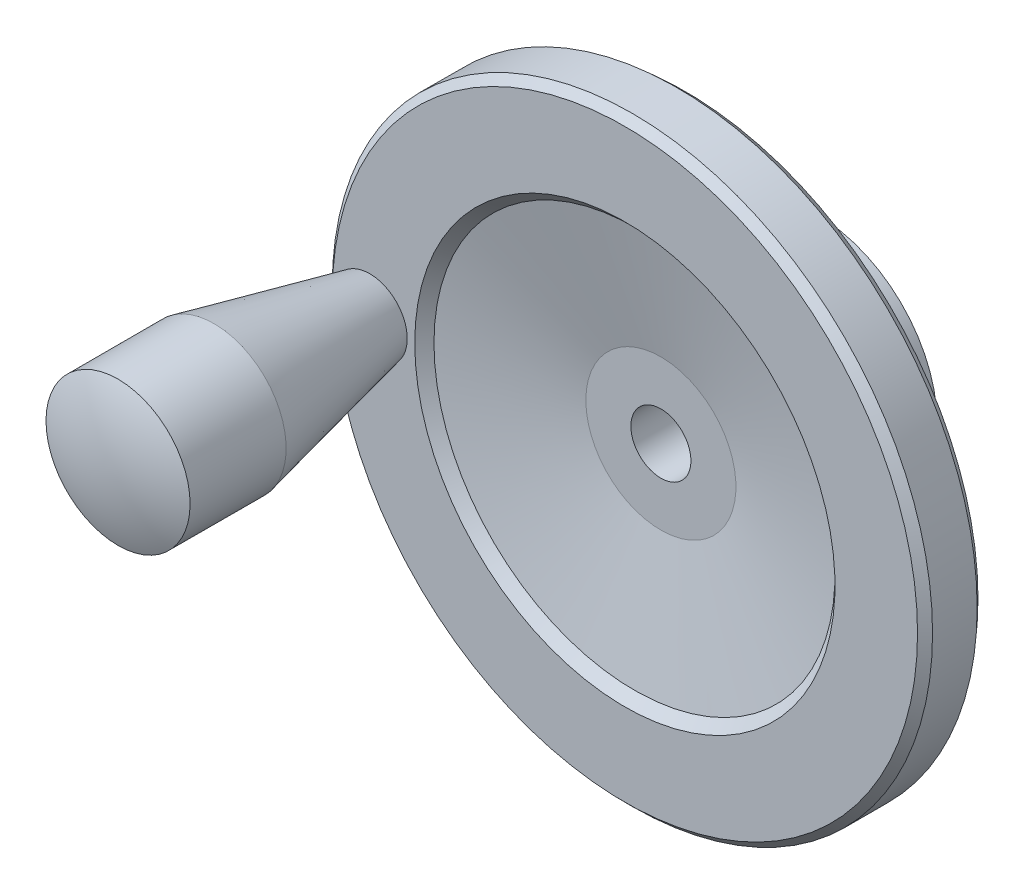
ISO-10303-21;
HEADER;
FILE_DESCRIPTION(('STEP AP214'),'2;1');
FILE_NAME('part.step','',(''),(''),'','','');
FILE_SCHEMA(('AUTOMOTIVE_DESIGN { 1 0 10303 214 1 1 1 1 }'));
ENDSEC;
DATA;
#1=APPLICATION_CONTEXT('core data for automotive mechanical design processes');
#2=APPLICATION_PROTOCOL_DEFINITION('international standard','automotive_design',2000,#1);
#3=PRODUCT_CONTEXT('',#1,'mechanical');
#4=PRODUCT('Part','Part','',(#3));
#5=PRODUCT_RELATED_PRODUCT_CATEGORY('part','',(#4));
#6=PRODUCT_DEFINITION_FORMATION('','',#4);
#7=PRODUCT_DEFINITION_CONTEXT('part definition',#1,'design');
#8=PRODUCT_DEFINITION('design','',#6,#7);
#9=PRODUCT_DEFINITION_SHAPE('','',#8);
#10=(LENGTH_UNIT() NAMED_UNIT(*) SI_UNIT(.MILLI.,.METRE.));
#11=(NAMED_UNIT(*) PLANE_ANGLE_UNIT() SI_UNIT($,.RADIAN.));
#12=(NAMED_UNIT(*) SI_UNIT($,.STERADIAN.) SOLID_ANGLE_UNIT());
#13=UNCERTAINTY_MEASURE_WITH_UNIT(LENGTH_MEASURE(1.E-05),#10,'distance_accuracy_value','');
#14=(GEOMETRIC_REPRESENTATION_CONTEXT(3) GLOBAL_UNCERTAINTY_ASSIGNED_CONTEXT((#13)) GLOBAL_UNIT_ASSIGNED_CONTEXT((#10,
#11,#12)) REPRESENTATION_CONTEXT('',''));
#15=CARTESIAN_POINT('',(0.,0.,0.));
#16=DIRECTION('',(0.,0.,1.));
#17=DIRECTION('',(1.,0.,0.));
#18=AXIS2_PLACEMENT_3D('',#15,#16,#17);
#19=CARTESIAN_POINT('',(0.,0.,6.35));
#20=DIRECTION('',(0.,0.,1.));
#21=DIRECTION('',(1.,0.,0.));
#22=AXIS2_PLACEMENT_3D('',#19,#20,#21);
#23=PLANE('',#22);
#24=CARTESIAN_POINT('',(0.,0.,6.34999999999999));
#25=DIRECTION('',(0.,0.,-1.));
#26=DIRECTION('',(-1.,0.,0.));
#27=AXIS2_PLACEMENT_3D('',#24,#25,#26);
#28=CIRCLE('',#27,22.225);
#29=CARTESIAN_POINT('',(-22.225,0.,6.34999999999999));
#30=VERTEX_POINT('',#29);
#31=EDGE_CURVE('E159',#30,#30,#28,.T.);
#32=ORIENTED_EDGE('',*,*,#31,.T.);
#33=EDGE_LOOP('',(#32));
#34=FACE_BOUND('',#33,.T.);
#35=CARTESIAN_POINT('',(0.,0.,6.35));
#36=DIRECTION('',(0.,0.,1.));
#37=DIRECTION('',(1.,0.,0.));
#38=AXIS2_PLACEMENT_3D('',#35,#36,#37);
#39=CIRCLE('',#38,30.95625);
#40=CARTESIAN_POINT('',(-30.95625,0.,6.35));
#41=VERTEX_POINT('',#40);
#42=EDGE_CURVE('E12',#41,#41,#39,.T.);
#43=ORIENTED_EDGE('',*,*,#42,.T.);
#44=CARTESIAN_POINT('',(-26.9875,0.,6.35));
#45=DIRECTION('',(0.,0.,-1.));
#46=DIRECTION('',(-1.,0.,0.));
#47=AXIS2_PLACEMENT_3D('',#44,#45,#46);
#48=CIRCLE('',#47,3.96875);
#49=EDGE_CURVE('E55',#41,#41,#48,.T.);
#50=ORIENTED_EDGE('',*,*,#49,.T.);
#51=EDGE_LOOP('',(#43,#50));
#52=FACE_BOUND('',#51,.T.);
#53=ADVANCED_FACE('F42',(#34,#52),#23,.T.);
#54=CARTESIAN_POINT('',(0.,0.,-13.97));
#55=DIRECTION('',(0.,0.,1.));
#56=DIRECTION('',(1.,0.,0.));
#57=AXIS2_PLACEMENT_3D('',#54,#55,#56);
#58=PLANE('',#57);
#59=CARTESIAN_POINT('',(0.,0.,-13.97));
#60=DIRECTION('',(0.,0.,1.));
#61=DIRECTION('',(1.,0.,0.));
#62=AXIS2_PLACEMENT_3D('',#59,#60,#61);
#63=CIRCLE('',#62,12.7);
#64=CARTESIAN_POINT('',(12.7,0.,-13.97));
#65=VERTEX_POINT('',#64);
#66=EDGE_CURVE('E174',#65,#65,#63,.T.);
#67=ORIENTED_EDGE('',*,*,#66,.F.);
#68=EDGE_LOOP('',(#67));
#69=FACE_BOUND('',#68,.T.);
#70=CARTESIAN_POINT('',(0.,0.,-13.97));
#71=DIRECTION('',(0.,0.,1.));
#72=DIRECTION('',(1.,0.,0.));
#73=AXIS2_PLACEMENT_3D('',#70,#71,#72);
#74=CIRCLE('',#73,8.255);
#75=CARTESIAN_POINT('',(8.255,0.,-13.97));
#76=VERTEX_POINT('',#75);
#77=EDGE_CURVE('E155',#76,#76,#74,.F.);
#78=ORIENTED_EDGE('',*,*,#77,.F.);
#79=EDGE_LOOP('',(#78));
#80=FACE_BOUND('',#79,.T.);
#81=ADVANCED_FACE('F106',(#69,#80),#58,.F.);
#82=CARTESIAN_POINT('',(0.,0.,6.35));
#83=DIRECTION('',(0.,0.,-1.));
#84=DIRECTION('',(-1.,0.,0.));
#85=AXIS2_PLACEMENT_3D('',#82,#83,#84);
#86=CYLINDRICAL_SURFACE('',#85,31.75);
#87=CARTESIAN_POINT('',(0.,0.,0.839659951334315));
#88=DIRECTION('',(0.,0.,1.));
#89=DIRECTION('',(1.,0.,0.));
#90=AXIS2_PLACEMENT_3D('',#87,#88,#89);
#91=CIRCLE('',#90,31.75);
#92=CARTESIAN_POINT('',(31.75,0.,0.839659951334315));
#93=VERTEX_POINT('',#92);
#94=EDGE_CURVE('E139',#93,#93,#91,.T.);
#95=ORIENTED_EDGE('',*,*,#94,.T.);
#96=EDGE_LOOP('',(#95));
#97=FACE_BOUND('',#96,.T.);
#98=CARTESIAN_POINT('',(0.,0.,5.55625));
#99=DIRECTION('',(0.,0.,1.));
#100=DIRECTION('',(1.,0.,0.));
#101=AXIS2_PLACEMENT_3D('',#98,#99,#100);
#102=CIRCLE('',#101,31.75);
#103=CARTESIAN_POINT('',(31.75,0.,5.55625));
#104=VERTEX_POINT('',#103);
#105=EDGE_CURVE('E140',#104,#104,#102,.F.);
#106=ORIENTED_EDGE('',*,*,#105,.T.);
#107=EDGE_LOOP('',(#106));
#108=FACE_BOUND('',#107,.T.);
#109=ADVANCED_FACE('F112',(#97,#108),#86,.T.);
#110=CARTESIAN_POINT('',(0.,0.,6.34999999999999));
#111=DIRECTION('',(0.,0.,1.));
#112=DIRECTION('',(1.,0.,0.));
#113=AXIS2_PLACEMENT_3D('',#110,#111,#112);
#114=CONICAL_SURFACE('',#113,22.225,0.785398163397447);
#115=CARTESIAN_POINT('',(0.,0.,5.33399999999999));
#116=DIRECTION('',(0.,0.,-1.));
#117=DIRECTION('',(-1.,0.,0.));
#118=AXIS2_PLACEMENT_3D('',#115,#116,#117);
#119=CIRCLE('',#118,21.209);
#120=CARTESIAN_POINT('',(-21.209,0.,5.33399999999999));
#121=VERTEX_POINT('',#120);
#122=EDGE_CURVE('E162',#121,#121,#119,.T.);
#123=ORIENTED_EDGE('',*,*,#122,.T.);
#124=EDGE_LOOP('',(#123));
#125=FACE_BOUND('',#124,.T.);
#126=ORIENTED_EDGE('',*,*,#31,.F.);
#127=EDGE_LOOP('',(#126));
#128=FACE_BOUND('',#127,.T.);
#129=ADVANCED_FACE('F118',(#125,#128),#114,.F.);
#130=CARTESIAN_POINT('',(0.,0.,5.33399999999999));
#131=DIRECTION('',(0.,0.,1.));
#132=DIRECTION('',(1.,0.,0.));
#133=AXIS2_PLACEMENT_3D('',#130,#131,#132);
#134=CONICAL_SURFACE('',#133,21.209,1.36330010035969);
#135=CARTESIAN_POINT('',(0.,0.,2.53999999999999));
#136=DIRECTION('',(0.,0.,-1.));
#137=DIRECTION('',(-1.,0.,0.));
#138=AXIS2_PLACEMENT_3D('',#135,#136,#137);
#139=CIRCLE('',#138,7.9375);
#140=CARTESIAN_POINT('',(-7.9375,0.,2.53999999999999));
#141=VERTEX_POINT('',#140);
#142=EDGE_CURVE('E165',#141,#141,#139,.T.);
#143=ORIENTED_EDGE('',*,*,#142,.T.);
#144=EDGE_LOOP('',(#143));
#145=FACE_BOUND('',#144,.T.);
#146=ORIENTED_EDGE('',*,*,#122,.F.);
#147=EDGE_LOOP('',(#146));
#148=FACE_BOUND('',#147,.T.);
#149=ADVANCED_FACE('F214',(#145,#148),#134,.F.);
#150=CARTESIAN_POINT('',(7.9375,0.,2.53999999999999));
#151=DIRECTION('',(0.,0.,1.));
#152=DIRECTION('',(1.,0.,0.));
#153=AXIS2_PLACEMENT_3D('',#150,#151,#152);
#154=PLANE('',#153);
#155=CARTESIAN_POINT('',(0.,0.,2.53999999999999));
#156=DIRECTION('',(0.,0.,1.));
#157=DIRECTION('',(1.,0.,0.));
#158=AXIS2_PLACEMENT_3D('',#155,#156,#157);
#159=CIRCLE('',#158,3.175);
#160=CARTESIAN_POINT('',(3.175,0.,2.53999999999999));
#161=VERTEX_POINT('',#160);
#162=EDGE_CURVE('E185',#161,#161,#159,.T.);
#163=ORIENTED_EDGE('',*,*,#162,.F.);
#164=EDGE_LOOP('',(#163));
#165=FACE_BOUND('',#164,.T.);
#166=ORIENTED_EDGE('',*,*,#142,.F.);
#167=EDGE_LOOP('',(#166));
#168=FACE_BOUND('',#167,.T.);
#169=ADVANCED_FACE('F208',(#165,#168),#154,.T.);
#170=CARTESIAN_POINT('',(0.,0.,-1.27));
#171=DIRECTION('',(0.,0.,1.));
#172=DIRECTION('',(1.,0.,0.));
#173=AXIS2_PLACEMENT_3D('',#170,#171,#172);
#174=CONICAL_SURFACE('',#173,7.9375,1.5175134752352);
#175=CARTESIAN_POINT('',(0.,0.,-0.0422732540646938));
#176=DIRECTION('',(0.,0.,-1.));
#177=DIRECTION('',(-1.,0.,0.));
#178=AXIS2_PLACEMENT_3D('',#175,#176,#177);
#179=CIRCLE('',#178,30.957376486287);
#180=CARTESIAN_POINT('',(30.957376486287,0.,-0.0422732540646936));
#181=VERTEX_POINT('',#180);
#182=EDGE_CURVE('E50',#181,#181,#179,.T.);
#183=CARTESIAN_POINT('',(0.,0.,-1.27));
#184=DIRECTION('',(0.,0.,-1.));
#185=DIRECTION('',(-1.,0.,0.));
#186=AXIS2_PLACEMENT_3D('',#183,#184,#185);
#187=CIRCLE('',#186,7.9375);
#188=CARTESIAN_POINT('',(7.93750000000001,0.,-1.27));
#189=VERTEX_POINT('',#188);
#190=EDGE_CURVE('E170',#189,#189,#187,.T.);
#191=CARTESIAN_POINT('',(30.957376486287,0.,-0.0422732540646936));
#192=CARTESIAN_POINT('',(30.7175861062215,0.,-0.0550620743348531));
#193=CARTESIAN_POINT('',(30.477795726156,0.,-0.0678508946050125));
#194=CARTESIAN_POINT('',(29.998214966025,0.,-0.0934285351453313));
#195=CARTESIAN_POINT('',(29.7584245859595,0.,-0.106217355415491));
#196=CARTESIAN_POINT('',(29.2788438258285,0.,-0.13179499595581));
#197=CARTESIAN_POINT('',(29.0390534457631,0.,-0.144583816225969));
#198=CARTESIAN_POINT('',(28.5594726856321,0.,-0.170161456766288));
#199=CARTESIAN_POINT('',(28.3196823055666,0.,-0.182950277036447));
#200=CARTESIAN_POINT('',(27.8401015454356,0.,-0.208527917576766));
#201=CARTESIAN_POINT('',(27.6003111653701,0.,-0.221316737846926));
#202=CARTESIAN_POINT('',(27.1207304052391,0.,-0.246894378387245));
#203=CARTESIAN_POINT('',(26.8809400251737,0.,-0.259683198657404));
#204=CARTESIAN_POINT('',(26.4013592650427,0.,-0.285260839197723));
#205=CARTESIAN_POINT('',(26.1615688849772,0.,-0.298049659467882));
#206=CARTESIAN_POINT('',(25.6819881248462,0.,-0.323627300008201));
#207=CARTESIAN_POINT('',(25.4421977447807,0.,-0.336416120278361));
#208=CARTESIAN_POINT('',(24.9626169846497,0.,-0.36199376081868));
#209=CARTESIAN_POINT('',(24.7228266045843,0.,-0.374782581088839));
#210=CARTESIAN_POINT('',(24.2432458444533,0.,-0.400360221629158));
#211=CARTESIAN_POINT('',(24.0034554643878,0.,-0.413149041899317));
#212=CARTESIAN_POINT('',(23.5238747042568,0.,-0.438726682439636));
#213=CARTESIAN_POINT('',(23.2840843241913,0.,-0.451515502709796));
#214=CARTESIAN_POINT('',(22.8045035640603,0.,-0.477093143250115));
#215=CARTESIAN_POINT('',(22.5647131839949,0.,-0.489881963520274));
#216=CARTESIAN_POINT('',(22.0851324238639,0.,-0.515459604060593));
#217=CARTESIAN_POINT('',(21.8453420437984,0.,-0.528248424330752));
#218=CARTESIAN_POINT('',(21.3657612836674,0.,-0.553826064871071));
#219=CARTESIAN_POINT('',(21.1259709036019,0.,-0.56661488514123));
#220=CARTESIAN_POINT('',(20.6463901434709,0.,-0.592192525681549));
#221=CARTESIAN_POINT('',(20.4065997634054,0.,-0.604981345951709));
#222=CARTESIAN_POINT('',(19.9270190032745,0.,-0.630558986492028));
#223=CARTESIAN_POINT('',(19.687228623209,0.,-0.643347806762187));
#224=CARTESIAN_POINT('',(19.207647863078,0.,-0.668925447302506));
#225=CARTESIAN_POINT('',(18.9678574830125,0.,-0.681714267572665));
#226=CARTESIAN_POINT('',(18.4882767228815,0.,-0.707291908112984));
#227=CARTESIAN_POINT('',(18.248486342816,0.,-0.720080728383144));
#228=CARTESIAN_POINT('',(17.7689055826851,0.,-0.745658368923463));
#229=CARTESIAN_POINT('',(17.5291152026196,0.,-0.758447189193622));
#230=CARTESIAN_POINT('',(17.0495344424886,0.,-0.784024829733941));
#231=CARTESIAN_POINT('',(16.8097440624231,0.,-0.7968136500041));
#232=CARTESIAN_POINT('',(16.3301633022921,0.,-0.822391290544419));
#233=CARTESIAN_POINT('',(16.0903729222266,0.,-0.835180110814579));
#234=CARTESIAN_POINT('',(15.6107921620957,0.,-0.860757751354898));
#235=CARTESIAN_POINT('',(15.3710017820302,0.,-0.873546571625057));
#236=CARTESIAN_POINT('',(14.8914210218992,0.,-0.899124212165376));
#237=CARTESIAN_POINT('',(14.6516306418337,0.,-0.911913032435535));
#238=CARTESIAN_POINT('',(14.1720498817027,0.,-0.937490672975854));
#239=CARTESIAN_POINT('',(13.9322595016372,0.,-0.950279493246014));
#240=CARTESIAN_POINT('',(13.4526787415063,0.,-0.975857133786333));
#241=CARTESIAN_POINT('',(13.2128883614408,0.,-0.988645954056492));
#242=CARTESIAN_POINT('',(12.7333076013098,0.,-1.01422359459681));
#243=CARTESIAN_POINT('',(12.4935172212443,0.,-1.02701241486697));
#244=CARTESIAN_POINT('',(12.0139364611133,0.,-1.05259005540729));
#245=CARTESIAN_POINT('',(11.7741460810478,0.,-1.06537887567745));
#246=CARTESIAN_POINT('',(11.2945653209169,0.,-1.09095651621777));
#247=CARTESIAN_POINT('',(11.0547749408514,0.,-1.10374533648793));
#248=CARTESIAN_POINT('',(10.5751941807204,0.,-1.12932297702825));
#249=CARTESIAN_POINT('',(10.3354038006549,0.,-1.14211179729841));
#250=CARTESIAN_POINT('',(9.85582304052392,0.,-1.16768943783872));
#251=CARTESIAN_POINT('',(9.61603266045844,0.,-1.18047825810888));
#252=CARTESIAN_POINT('',(9.13645190032746,0.,-1.2060558986492));
#253=CARTESIAN_POINT('',(8.89666152026197,0.,-1.21884471891936));
#254=CARTESIAN_POINT('',(8.41708076013099,0.,-1.24442235945968));
#255=CARTESIAN_POINT('',(8.1772903800655,0.,-1.25721117972984));
#256=CARTESIAN_POINT('',(7.93750000000001,0.,-1.27));
#257=B_SPLINE_CURVE_WITH_KNOTS('',3,(#191,#192,#193,#194,#195,#196,#197,#198,#199,#200,#201,
#202,#203,#204,#205,#206,#207,#208,#209,#210,#211,#212,#213,#214,#215,#216,#217,#218,#219,#220,
#221,#222,#223,#224,#225,#226,#227,#228,#229,#230,#231,#232,#233,#234,#235,#236,#237,#238,#239,
#240,#241,#242,#243,#244,#245,#246,#247,#248,#249,#250,#251,#252,#253,#254,#255,#256),
.UNSPECIFIED.,.F.,.F.,(4,2,2,2,2,2,2,2,2,2,2,2,2,2,2,2,2,2,2,2,2,2,2,2,2,2,2,2,2,2,2,2,4),(0.,
0.720393519309193,1.44078703861839,2.16118055792759,2.88157407723678,3.60196759654598,
4.32236111585517,5.04275463516437,5.76314815447356,6.48354167378276,7.20393519309195,
7.92432871240115,8.64472223171034,9.36511575101953,10.0855092703287,10.8059027896379,
11.5262963089471,12.2466898282563,12.9670833475655,13.6874768668747,14.4078703861839,
15.1282639054931,15.8486574248023,16.5690509441115,17.2894444634207,18.0098379827299,
18.7302315020391,19.4506250213483,20.1710185406575,20.8914120599667,21.6118055792759,
22.3321990985851,23.0525926178942),.UNSPECIFIED.);
#258=EDGE_CURVE('BSEAM202',#181,#189,#257,.T.);
#259=ORIENTED_EDGE('',*,*,#182,.T.);
#260=ORIENTED_EDGE('',*,*,#190,.F.);
#261=ORIENTED_EDGE('',*,*,#258,.T.);
#262=ORIENTED_EDGE('',*,*,#258,.F.);
#263=EDGE_LOOP('',(#259,#261,#260,#262));
#264=FACE_BOUND('',#263,.T.);
#265=ADVANCED_FACE('F202',(#264),#174,.T.);
#266=CARTESIAN_POINT('',(0.,0.,-7.62));
#267=DIRECTION('',(0.,0.,1.));
#268=DIRECTION('',(1.,0.,0.));
#269=AXIS2_PLACEMENT_3D('',#266,#267,#268);
#270=CYLINDRICAL_SURFACE('',#269,7.9375);
#271=CARTESIAN_POINT('',(-7.9375,0.,-1.79070000000001));
#272=CARTESIAN_POINT('',(-7.93749816002049,-0.111503398078413,-1.79070301087657));
#273=CARTESIAN_POINT('',(-7.93512712027587,-0.223040059295097,-1.79996667520844));
#274=CARTESIAN_POINT('',(-7.92589845272975,-0.442912489839705,-1.83671847716166));
#275=CARTESIAN_POINT('',(-7.9190383814496,-0.551246482298939,-1.86421654027656));
#276=CARTESIAN_POINT('',(-7.9015906585303,-0.761507028243949,-1.93649449462618));
#277=CARTESIAN_POINT('',(-7.89100757037762,-0.863441246794077,-1.98125323502619));
#278=CARTESIAN_POINT('',(-7.86723867370605,-1.05835486949294,-2.08670655576371));
#279=CARTESIAN_POINT('',(-7.85405275492695,-1.15133389403648,-2.14740181123434));
#280=CARTESIAN_POINT('',(-7.82619410708127,-1.32767529850183,-2.28436861412058));
#281=CARTESIAN_POINT('',(-7.8114977905554,-1.41082008434518,-2.3609155229406));
#282=CARTESIAN_POINT('',(-7.78243004832225,-1.56324103842942,-2.52682343563716));
#283=CARTESIAN_POINT('',(-7.7680586607557,-1.63251558597806,-2.61618593488249));
#284=CARTESIAN_POINT('',(-7.74102926906689,-1.75626265170812,-2.80689009280748));
#285=CARTESIAN_POINT('',(-7.72840116269003,-1.81048997798445,-2.90839547915738));
#286=CARTESIAN_POINT('',(-7.70663285880925,-1.90102585405554,-3.11945497058204));
#287=CARTESIAN_POINT('',(-7.69749208189701,-1.93733738079571,-3.22900773500122));
#288=CARTESIAN_POINT('',(-7.6839761021266,-1.99026513489226,-3.45065501807786));
#289=CARTESIAN_POINT('',(-7.67950617818345,-2.00727345615104,-3.56264999559032));
#290=CARTESIAN_POINT('',(-7.67555461600948,-2.02233359726657,-3.78798601918889));
#291=CARTESIAN_POINT('',(-7.67607213547378,-2.02038861805277,-3.90132683475382));
#292=CARTESIAN_POINT('',(-7.68195193484191,-1.99790980194531,-4.12311798112947));
#293=CARTESIAN_POINT('',(-7.68719195548542,-1.97784503574137,-4.2316196026368));
#294=CARTESIAN_POINT('',(-7.70173126273645,-1.92044525717152,-4.44366365440085));
#295=CARTESIAN_POINT('',(-7.71103084765711,-1.88310897561297,-4.54720571958873));
#296=CARTESIAN_POINT('',(-7.73275244872648,-1.79183081789414,-4.74764018840945));
#297=CARTESIAN_POINT('',(-7.74520594630838,-1.73772020622837,-4.84445219439667));
#298=CARTESIAN_POINT('',(-7.77181462555737,-1.61454732074231,-5.02778944212458));
#299=CARTESIAN_POINT('',(-7.78597011448625,-1.54548234539153,-5.11431282082684));
#300=CARTESIAN_POINT('',(-7.81490107198831,-1.39193958661512,-5.27730274624502));
#301=CARTESIAN_POINT('',(-7.82968249645327,-1.30706645875347,-5.35339628841263));
#302=CARTESIAN_POINT('',(-7.8578229461783,-1.12558600074782,-5.49034253030235));
#303=CARTESIAN_POINT('',(-7.87118192489005,-1.0289782868209,-5.55119473135273));
#304=CARTESIAN_POINT('',(-7.89504267368315,-0.826227078247713,-5.65607486567204));
#305=CARTESIAN_POINT('',(-7.9055338112987,-0.72004998832284,-5.70004042958235));
#306=CARTESIAN_POINT('',(-7.92239962662862,-0.50148514980063,-5.76939353773939));
#307=CARTESIAN_POINT('',(-7.92877512054522,-0.38909863743981,-5.79478476572628));
#308=CARTESIAN_POINT('',(-7.93656983337389,-0.164492808121927,-5.82569465708688));
#309=CARTESIAN_POINT('',(-7.93811565401553,-0.0523476554168241,-5.83172105993389));
#310=CARTESIAN_POINT('',(-7.93643831154206,0.171349315723136,-5.82512530390916));
#311=CARTESIAN_POINT('',(-7.93321559401008,0.28290118861794,-5.81250488743918));
#312=CARTESIAN_POINT('',(-7.92244458469611,0.500468334229656,-5.76939175399593));
#313=CARTESIAN_POINT('',(-7.9149637609624,0.606542457585203,-5.73917763454095));
#314=CARTESIAN_POINT('',(-7.89652100083225,0.812109942194255,-5.6620543511128));
#315=CARTESIAN_POINT('',(-7.88555870582623,0.911602624249008,-5.61514346722625));
#316=CARTESIAN_POINT('',(-7.86106744858432,1.10319094964695,-5.50498522049568));
#317=CARTESIAN_POINT('',(-7.84749533139252,1.19511864088525,-5.44145558140435));
#318=CARTESIAN_POINT('',(-7.81935530263441,1.36718817481565,-5.30022245191821));
#319=CARTESIAN_POINT('',(-7.80478721307994,1.44732790279812,-5.22251642392844));
#320=CARTESIAN_POINT('',(-7.77583879234541,1.59565130804696,-5.05277553324284));
#321=CARTESIAN_POINT('',(-7.76147270708816,1.66347825059062,-4.96042597867727));
#322=CARTESIAN_POINT('',(-7.73496752417001,1.78267397543408,-4.76535767480774));
#323=CARTESIAN_POINT('',(-7.72282832864778,1.83404348103489,-4.66263938146877));
#324=CARTESIAN_POINT('',(-7.70228694397818,1.91848150117721,-4.4502928765654));
#325=CARTESIAN_POINT('',(-7.69386272288785,1.95165820338814,-4.34070992876195));
#326=CARTESIAN_POINT('',(-7.68168770839288,1.99904730167293,-4.11727334987908));
#327=CARTESIAN_POINT('',(-7.67793584933284,2.01326402212316,-4.00342069872258));
#328=CARTESIAN_POINT('',(-7.67561362323475,2.02209764720633,-3.77831227637714));
#329=CARTESIAN_POINT('',(-7.67689230766973,2.01728551668371,-3.66708011569547));
#330=CARTESIAN_POINT('',(-7.68413695162975,1.9895093545208,-3.4470692935877));
#331=CARTESIAN_POINT('',(-7.69010281039395,1.96654571308604,-3.33829057947123));
#332=CARTESIAN_POINT('',(-7.70596396634511,1.90343529435007,-3.12692051644875));
#333=CARTESIAN_POINT('',(-7.71583392345196,1.86339919983679,-3.02429408706908));
#334=CARTESIAN_POINT('',(-7.73839394276666,1.76736739517097,-2.82714042253614));
#335=CARTESIAN_POINT('',(-7.75108440967796,1.71136939438349,-2.73261435236997));
#336=CARTESIAN_POINT('',(-7.77828294081991,1.58322877348736,-2.55159422892804));
#337=CARTESIAN_POINT('',(-7.79283077842513,1.51069165506314,-2.46538536534951));
#338=CARTESIAN_POINT('',(-7.82187150616117,1.35229586813726,-2.30617779963382));
#339=CARTESIAN_POINT('',(-7.83636438234261,1.26643402294028,-2.23318225664588));
#340=CARTESIAN_POINT('',(-7.86398994917061,1.08186355587165,-2.1011225438378));
#341=CARTESIAN_POINT('',(-7.87709168255394,0.982942434749125,-2.04234838807517));
#342=CARTESIAN_POINT('',(-7.90012920674897,0.776297761221593,-1.94235741264225));
#343=CARTESIAN_POINT('',(-7.91006720448157,0.668580410982254,-1.90112834728707));
#344=CARTESIAN_POINT('',(-7.92423545810886,0.467589183826791,-1.84332763759659));
#345=CARTESIAN_POINT('',(-7.92917496350255,0.375250208911855,-1.82363573731096));
#346=CARTESIAN_POINT('',(-7.93580788140303,0.188615316992517,-1.79732117352952));
#347=CARTESIAN_POINT('',(-7.93750155641944,0.0943195588683766,-1.790697453131));
#348=CARTESIAN_POINT('',(-7.9375,0.,-1.79070000000001));
#349=B_SPLINE_CURVE_WITH_KNOTS('',3,(#271,#272,#273,#274,#275,#276,#277,#278,#279,#280,#281,
#282,#283,#284,#285,#286,#287,#288,#289,#290,#291,#292,#293,#294,#295,#296,#297,#298,#299,#300,
#301,#302,#303,#304,#305,#306,#307,#308,#309,#310,#311,#312,#313,#314,#315,#316,#317,#318,#319,
#320,#321,#322,#323,#324,#325,#326,#327,#328,#329,#330,#331,#332,#333,#334,#335,#336,#337,#338,
#339,#340,#341,#342,#343,#344,#345,#346,#347,#348),.UNSPECIFIED.,.T.,.F.,(4,2,2,2,2,2,2,2,2,2,2,
2,2,2,2,2,2,2,2,2,2,2,2,2,2,2,2,2,2,2,2,2,2,2,2,2,2,2,4),(0.,0.334164484371241,
0.668511013298198,1.00244913692187,1.33640140975415,1.67673208193919,2.01710249747929,
2.36273092362982,2.70830189971986,3.04672031013988,3.38508156773417,3.71492705213757,
4.04479677899854,4.37809872679735,4.71146093645367,5.05467999197064,5.39791027558673,
5.74239633260812,6.08681405117476,6.4221242648592,6.75740314836629,7.08751192486792,
7.4176547153184,7.75381718860838,8.09003989463379,8.43483092612514,8.77960680204131,
9.12230951849167,9.46493405822523,9.79735724148907,10.1297732788005,10.4600662257494,
10.790406595718,11.1296514585424,11.468977323992,11.8147293837015,12.1602397266312,
12.4429288345909,12.7255950788359),.UNSPECIFIED.);
#350=CARTESIAN_POINT('',(-7.9375,0.,-1.79070000000001));
#351=VERTEX_POINT('',#350);
#352=EDGE_CURVE('E67',#351,#351,#349,.T.);
#353=ORIENTED_EDGE('',*,*,#352,.T.);
#354=EDGE_LOOP('',(#353));
#355=FACE_BOUND('',#354,.T.);
#356=CARTESIAN_POINT('',(0.,0.,-7.62));
#357=DIRECTION('',(0.,0.,-1.));
#358=DIRECTION('',(-1.,0.,0.));
#359=AXIS2_PLACEMENT_3D('',#356,#357,#358);
#360=CIRCLE('',#359,7.9375);
#361=CARTESIAN_POINT('',(-7.9375,0.,-7.62));
#362=VERTEX_POINT('',#361);
#363=EDGE_CURVE('E169',#362,#362,#360,.T.);
#364=ORIENTED_EDGE('',*,*,#363,.F.);
#365=EDGE_LOOP('',(#364));
#366=FACE_BOUND('',#365,.T.);
#367=ORIENTED_EDGE('',*,*,#190,.T.);
#368=EDGE_LOOP('',(#367));
#369=FACE_BOUND('',#368,.T.);
#370=ADVANCED_FACE('F197',(#355,#366,#369),#270,.T.);
#371=CARTESIAN_POINT('',(0.,0.,-7.62));
#372=DIRECTION('',(0.,0.,-1.));
#373=DIRECTION('',(-1.,0.,0.));
#374=AXIS2_PLACEMENT_3D('',#371,#372,#373);
#375=PLANE('',#374);
#376=CARTESIAN_POINT('',(0.,0.,-7.62));
#377=DIRECTION('',(0.,0.,-1.));
#378=DIRECTION('',(-1.,0.,0.));
#379=AXIS2_PLACEMENT_3D('',#376,#377,#378);
#380=CIRCLE('',#379,11.90625);
#381=CARTESIAN_POINT('',(-11.90625,0.,-7.62));
#382=VERTEX_POINT('',#381);
#383=EDGE_CURVE('E145',#382,#382,#380,.F.);
#384=ORIENTED_EDGE('',*,*,#383,.T.);
#385=EDGE_LOOP('',(#384));
#386=FACE_BOUND('',#385,.T.);
#387=ORIENTED_EDGE('',*,*,#363,.T.);
#388=EDGE_LOOP('',(#387));
#389=FACE_BOUND('',#388,.T.);
#390=ADVANCED_FACE('F201',(#386,#389),#375,.F.);
#391=CARTESIAN_POINT('',(0.,0.,-70.2110244842766));
#392=DIRECTION('',(0.,0.,1.));
#393=DIRECTION('',(1.,0.,0.));
#394=AXIS2_PLACEMENT_3D('',#391,#392,#393);
#395=CYLINDRICAL_SURFACE('',#394,12.7);
#396=CARTESIAN_POINT('',(0.,0.,-8.41375));
#397=DIRECTION('',(0.,0.,-1.));
#398=DIRECTION('',(-1.,0.,0.));
#399=AXIS2_PLACEMENT_3D('',#396,#397,#398);
#400=CIRCLE('',#399,12.7);
#401=CARTESIAN_POINT('',(-12.7,0.,-8.41375));
#402=VERTEX_POINT('',#401);
#403=EDGE_CURVE('E151',#402,#402,#400,.T.);
#404=ORIENTED_EDGE('',*,*,#403,.T.);
#405=EDGE_LOOP('',(#404));
#406=FACE_BOUND('',#405,.T.);
#407=ORIENTED_EDGE('',*,*,#66,.T.);
#408=EDGE_LOOP('',(#407));
#409=FACE_BOUND('',#408,.T.);
#410=ADVANCED_FACE('F258',(#406,#409),#395,.T.);
#411=CARTESIAN_POINT('',(0.,0.,-14.224));
#412=DIRECTION('',(0.,0.,1.));
#413=DIRECTION('',(1.,0.,0.));
#414=AXIS2_PLACEMENT_3D('',#411,#412,#413);
#415=CYLINDRICAL_SURFACE('',#414,8.255);
#416=CARTESIAN_POINT('',(0.,0.,-14.224));
#417=DIRECTION('',(0.,0.,-1.));
#418=DIRECTION('',(-1.,0.,0.));
#419=AXIS2_PLACEMENT_3D('',#416,#417,#418);
#420=CIRCLE('',#419,8.255);
#421=CARTESIAN_POINT('',(-8.255,0.,-14.224));
#422=VERTEX_POINT('',#421);
#423=EDGE_CURVE('E181',#422,#422,#420,.T.);
#424=ORIENTED_EDGE('',*,*,#423,.F.);
#425=EDGE_LOOP('',(#424));
#426=FACE_BOUND('',#425,.T.);
#427=ORIENTED_EDGE('',*,*,#77,.T.);
#428=EDGE_LOOP('',(#427));
#429=FACE_BOUND('',#428,.T.);
#430=ADVANCED_FACE('F253',(#426,#429),#415,.T.);
#431=CARTESIAN_POINT('',(0.,0.,-14.224));
#432=DIRECTION('',(0.,0.,-1.));
#433=DIRECTION('',(-1.,0.,0.));
#434=AXIS2_PLACEMENT_3D('',#431,#432,#433);
#435=PLANE('',#434);
#436=CARTESIAN_POINT('',(0.,0.,-14.224));
#437=DIRECTION('',(0.,0.,-1.));
#438=DIRECTION('',(-1.,0.,0.));
#439=AXIS2_PLACEMENT_3D('',#436,#437,#438);
#440=CIRCLE('',#439,3.175);
#441=CARTESIAN_POINT('',(-3.175,0.,-14.224));
#442=VERTEX_POINT('',#441);
#443=EDGE_CURVE('E188',#442,#442,#440,.T.);
#444=ORIENTED_EDGE('',*,*,#443,.F.);
#445=EDGE_LOOP('',(#444));
#446=FACE_BOUND('',#445,.T.);
#447=ORIENTED_EDGE('',*,*,#423,.T.);
#448=EDGE_LOOP('',(#447));
#449=FACE_BOUND('',#448,.T.);
#450=ADVANCED_FACE('F257',(#446,#449),#435,.T.);
#451=CARTESIAN_POINT('',(0.,0.,6.35));
#452=DIRECTION('',(0.,0.,-1.));
#453=DIRECTION('',(-1.,0.,0.));
#454=AXIS2_PLACEMENT_3D('',#451,#452,#453);
#455=CYLINDRICAL_SURFACE('',#454,3.175);
#456=CARTESIAN_POINT('',(-3.175,0.,-1.79070000000001));
#457=CARTESIAN_POINT('',(-3.17499212218742,0.102275041570351,-1.79070856034447));
#458=CARTESIAN_POINT('',(-3.17000679874075,0.204663948744718,-1.79852303643118));
#459=CARTESIAN_POINT('',(-3.15053510862914,0.406278072049933,-1.82935472895225));
#460=CARTESIAN_POINT('',(-3.13603219182987,0.505497460962833,-1.85239842796179));
#461=CARTESIAN_POINT('',(-3.09897945913749,0.697469668100846,-1.91232463345242));
#462=CARTESIAN_POINT('',(-3.07646968317457,0.790251965874983,-1.94913832667048));
#463=CARTESIAN_POINT('',(-3.02526013654449,0.967983856054423,-2.03508159848125));
#464=CARTESIAN_POINT('',(-2.9965608310332,1.05293403637499,-2.08421025162442));
#465=CARTESIAN_POINT('',(-2.93256277924019,1.22039873226055,-2.19777968831074));
#466=CARTESIAN_POINT('',(-2.89691724195524,1.3021541541713,-2.26314043340878));
#467=CARTESIAN_POINT('',(-2.82362413681097,1.45427585258572,-2.40518485240048));
#468=CARTESIAN_POINT('',(-2.78597386455601,1.52462619854515,-2.48188408293657));
#469=CARTESIAN_POINT('',(-2.70653031413333,1.66206543309412,-2.65708687311127));
#470=CARTESIAN_POINT('',(-2.66490287506758,1.72729055130935,-2.75714002169202));
#471=CARTESIAN_POINT('',(-2.58848866777314,1.83983395520866,-2.96920929931244));
#472=CARTESIAN_POINT('',(-2.55369025311667,1.88718285725214,-3.08120454936803));
#473=CARTESIAN_POINT('',(-2.50463798235853,1.95156224001302,-3.28364642646877));
#474=CARTESIAN_POINT('',(-2.48737926319143,1.97331282288364,-3.37185840081987));
#475=CARTESIAN_POINT('',(-2.46209734155056,2.00477482055267,-3.55164412264921));
#476=CARTESIAN_POINT('',(-2.45406037559985,2.01450417871409,-3.64321264911297));
#477=CARTESIAN_POINT('',(-2.44844089318852,2.02133295126505,-3.82742644400769));
#478=CARTESIAN_POINT('',(-2.45088932499695,2.01839497710359,-3.92007409387714));
#479=CARTESIAN_POINT('',(-2.46591124637832,2.00000919911576,-4.10330892180089));
#480=CARTESIAN_POINT('',(-2.47849303179026,1.98455114545894,-4.19389434907854));
#481=CARTESIAN_POINT('',(-2.5114634605905,1.94264067552021,-4.36815660574709));
#482=CARTESIAN_POINT('',(-2.531624868821,1.91650651911699,-4.45195559163133));
#483=CARTESIAN_POINT('',(-2.5775203144075,1.85432038094186,-4.6141268599534));
#484=CARTESIAN_POINT('',(-2.60325621174054,1.8182650878077,-4.69249731956928));
#485=CARTESIAN_POINT('',(-2.66335210414009,1.72932876824588,-4.85756420862492));
#486=CARTESIAN_POINT('',(-2.6984196544858,1.67454743777151,-4.9429781231468));
#487=CARTESIAN_POINT('',(-2.77005411277688,1.55319088466405,-5.10436513819511));
#488=CARTESIAN_POINT('',(-2.80662274219305,1.48660181281294,-5.18032697243656));
#489=CARTESIAN_POINT('',(-2.88474864185399,1.32960028569559,-5.33442980683521));
#490=CARTESIAN_POINT('',(-2.92603774183837,1.23705711933929,-5.41055964392835));
#491=CARTESIAN_POINT('',(-3.00234660451871,1.03819212296361,-5.54613496814226));
#492=CARTESIAN_POINT('',(-3.03737313810322,0.931885390793913,-5.6055985143101));
#493=CARTESIAN_POINT('',(-3.09131764246758,0.730092345463672,-5.69525833040918));
#494=CARTESIAN_POINT('',(-3.11205186463951,0.636630347052196,-5.72891814909189));
#495=CARTESIAN_POINT('',(-3.14525139549152,0.444413569663531,-5.7823071130987));
#496=CARTESIAN_POINT('',(-3.15772328793695,0.345663072769133,-5.80204735092908));
#497=CARTESIAN_POINT('',(-3.17327247447325,0.145247031750997,-5.82660545426344));
#498=CARTESIAN_POINT('',(-3.17631951183841,0.0435731547102205,-5.83137526073012));
#499=CARTESIAN_POINT('',(-3.17262837891011,-0.159161564830493,-5.82557027759349));
#500=CARTESIAN_POINT('',(-3.16588947737162,-0.260222360951872,-5.8149943412941));
#501=CARTESIAN_POINT('',(-3.14386957546433,-0.453545546030752,-5.78003398927968));
#502=CARTESIAN_POINT('',(-3.12903933230956,-0.545994183259854,-5.75637741421511));
#503=CARTESIAN_POINT('',(-3.09238314692143,-0.725383942286242,-5.69688328974225));
#504=CARTESIAN_POINT('',(-3.07055602506331,-0.812324132435727,-5.66104368629908));
#505=CARTESIAN_POINT('',(-3.01962653249605,-0.985513554819464,-5.57532469067285));
#506=CARTESIAN_POINT('',(-2.99009760848239,-1.07120913338102,-5.52458591832283));
#507=CARTESIAN_POINT('',(-2.92697501640169,-1.23329766280981,-5.41196928369765));
#508=CARTESIAN_POINT('',(-2.89337810863513,-1.30968310074507,-5.35008252389905));
#509=CARTESIAN_POINT('',(-2.81925311715627,-1.46312883138038,-5.20624590798107));
#510=CARTESIAN_POINT('',(-2.77844582051285,-1.5385399767099,-5.12267704038414));
#511=CARTESIAN_POINT('',(-2.69848578412998,-1.67482589073676,-4.94366099064735));
#512=CARTESIAN_POINT('',(-2.65933325774613,-1.73569878964202,-4.84821228301693));
#513=CARTESIAN_POINT('',(-2.59242399914096,-1.83384260188465,-4.66094873261184));
#514=CARTESIAN_POINT('',(-2.56383843593366,-1.87323995547865,-4.57055147586049));
#515=CARTESIAN_POINT('',(-2.51461975244491,-1.93881492302713,-4.3830630228434));
#516=CARTESIAN_POINT('',(-2.49397544693689,-1.96501114696942,-4.28598147045225));
#517=CARTESIAN_POINT('',(-2.46366295169804,-2.00290039729267,-4.08632721566094));
#518=CARTESIAN_POINT('',(-2.45409505725333,-2.01446098670787,-3.98371300996414));
#519=CARTESIAN_POINT('',(-2.44816666813603,-2.02166710369554,-3.77756691792962));
#520=CARTESIAN_POINT('',(-2.4517981050102,-2.01732235383119,-3.67403563078493));
#521=CARTESIAN_POINT('',(-2.47012079556712,-1.99481282731698,-3.48417327985162));
#522=CARTESIAN_POINT('',(-2.48322286589143,-1.97863020035238,-3.39743438842213));
#523=CARTESIAN_POINT('',(-2.51688812246692,-1.93562453165795,-3.22813116385408));
#524=CARTESIAN_POINT('',(-2.53745848413263,-1.9087912546343,-3.14557093271985));
#525=CARTESIAN_POINT('',(-2.59188888887618,-1.83453213645738,-2.95828220070069));
#526=CARTESIAN_POINT('',(-2.62788562529029,-1.78319601633737,-2.85572695005249));
#527=CARTESIAN_POINT('',(-2.70432924352511,-1.66498968273404,-2.66182080657535));
#528=CARTESIAN_POINT('',(-2.74478205404976,-1.59809863913568,-2.57048519122557));
#529=CARTESIAN_POINT('',(-2.82622298925022,-1.4492614573701,-2.39925301215242));
#530=CARTESIAN_POINT('',(-2.86721208276524,-1.3671568638917,-2.31949426407681));
#531=CARTESIAN_POINT('',(-2.94534120010865,-1.18954498293631,-2.17423549387465));
#532=CARTESIAN_POINT('',(-2.98248124750827,-1.09403777754424,-2.10873538442667));
#533=CARTESIAN_POINT('',(-3.05013846389934,-0.888385881992069,-1.9927006623515));
#534=CARTESIAN_POINT('',(-3.08046045600151,-0.777927590640476,-1.94259486685122));
#535=CARTESIAN_POINT('',(-3.11730041421457,-0.605427728914396,-1.8826322139386));
#536=CARTESIAN_POINT('',(-3.12813464368599,-0.546842243784912,-1.865185280894));
#537=CARTESIAN_POINT('',(-3.14661127671427,-0.427869843173635,-1.83560225725261));
#538=CARTESIAN_POINT('',(-3.15425595157205,-0.367484242510024,-1.82346238716921));
#539=CARTESIAN_POINT('',(-3.16507251999973,-0.255971221121611,-1.80633659823335));
#540=CARTESIAN_POINT('',(-3.16878594100635,-0.205027735964818,-1.80048198061033));
#541=CARTESIAN_POINT('',(-3.17375169673817,-0.102732421224252,-1.79266147290259));
#542=CARTESIAN_POINT('',(-3.17500395762807,-0.0513805794361011,-1.79069569948395));
#543=CARTESIAN_POINT('',(-3.175,0.,-1.79070000000001));
#544=B_SPLINE_CURVE_WITH_KNOTS('',3,(#456,#457,#458,#459,#460,#461,#462,#463,#464,#465,#466,
#467,#468,#469,#470,#471,#472,#473,#474,#475,#476,#477,#478,#479,#480,#481,#482,#483,#484,#485,
#486,#487,#488,#489,#490,#491,#492,#493,#494,#495,#496,#497,#498,#499,#500,#501,#502,#503,#504,
#505,#506,#507,#508,#509,#510,#511,#512,#513,#514,#515,#516,#517,#518,#519,#520,#521,#522,#523,
#524,#525,#526,#527,#528,#529,#530,#531,#532,#533,#534,#535,#536,#537,#538,#539,#540,#541,#542,
#543),.UNSPECIFIED.,.T.,.F.,(4,2,2,2,2,2,2,2,2,2,2,2,2,2,2,2,2,2,2,2,2,2,2,2,2,2,2,2,2,2,2,2,2,
2,2,2,2,2,2,2,2,2,2,4),(0.,0.306618688447366,0.613771973685193,0.919410384700765,
1.2250258343603,1.55547991466606,1.88639166683373,2.26403741166171,2.64103340143298,
2.91733101609382,3.19321571765492,3.46991526949969,3.74684157658549,4.01605368121483,
4.28535574956628,4.60626536454537,4.92755389229748,5.3059319215214,5.68389835350099,
5.98703820526839,6.28993621120917,6.59380561032803,6.89769771696903,7.18617094760006,
7.47469283839889,7.78512110231493,8.09579823449314,8.45351764572918,8.81128303920727,
9.11810928918365,9.42450177937297,9.73364742929525,10.0426041372508,10.3090843788023,
10.5758213307902,10.9345409073162,11.293743651991,11.6569225744499,12.0200992726999,
12.3926282643871,12.5785937254861,12.7644265325087,12.918459941123,13.0724979706996),.UNSPECIFIED.);
#545=CARTESIAN_POINT('',(-3.175,0.,-1.79070000000001));
#546=VERTEX_POINT('',#545);
#547=EDGE_CURVE('E60',#546,#546,#544,.T.);
#548=ORIENTED_EDGE('',*,*,#547,.T.);
#549=EDGE_LOOP('',(#548));
#550=FACE_BOUND('',#549,.T.);
#551=ORIENTED_EDGE('',*,*,#162,.T.);
#552=EDGE_LOOP('',(#551));
#553=FACE_BOUND('',#552,.T.);
#554=ORIENTED_EDGE('',*,*,#443,.T.);
#555=EDGE_LOOP('',(#554));
#556=FACE_BOUND('',#555,.T.);
#557=ADVANCED_FACE('F126',(#550,#553,#556),#455,.F.);
#558=CARTESIAN_POINT('',(0.,0.,-8.41375));
#559=DIRECTION('',(0.,0.,-1.));
#560=DIRECTION('',(-1.,0.,0.));
#561=AXIS2_PLACEMENT_3D('',#558,#559,#560);
#562=TOROIDAL_SURFACE('',#561,11.90625,0.79375);
#563=ORIENTED_EDGE('',*,*,#383,.F.);
#564=EDGE_LOOP('',(#563));
#565=FACE_BOUND('',#564,.T.);
#566=ORIENTED_EDGE('',*,*,#403,.F.);
#567=EDGE_LOOP('',(#566));
#568=FACE_BOUND('',#567,.T.);
#569=ADVANCED_FACE('F123',(#565,#568),#562,.T.);
#570=CARTESIAN_POINT('',(0.,0.,0.839659951334315));
#571=DIRECTION('',(0.,0.,1.));
#572=DIRECTION('',(1.,0.,0.));
#573=AXIS2_PLACEMENT_3D('',#570,#571,#572);
#574=CONICAL_SURFACE('',#573,31.75,0.732115311837754);
#575=ORIENTED_EDGE('',*,*,#182,.F.);
#576=EDGE_LOOP('',(#575));
#577=FACE_BOUND('',#576,.T.);
#578=ORIENTED_EDGE('',*,*,#94,.F.);
#579=EDGE_LOOP('',(#578));
#580=FACE_BOUND('',#579,.T.);
#581=ADVANCED_FACE('F125',(#577,#580),#574,.T.);
#582=CARTESIAN_POINT('',(0.,0.,6.35));
#583=DIRECTION('',(0.,0.,-1.));
#584=DIRECTION('',(-1.,0.,0.));
#585=AXIS2_PLACEMENT_3D('',#582,#583,#584);
#586=CONICAL_SURFACE('',#585,30.95625,0.785398163397444);
#587=ORIENTED_EDGE('',*,*,#105,.F.);
#588=EDGE_LOOP('',(#587));
#589=FACE_BOUND('',#588,.T.);
#590=ORIENTED_EDGE('',*,*,#42,.F.);
#591=EDGE_LOOP('',(#590));
#592=FACE_BOUND('',#591,.T.);
#593=ADVANCED_FACE('F44',(#589,#592),#586,.T.);
#594=CARTESIAN_POINT('',(-7.9375,0.,-3.81));
#595=DIRECTION('',(-1.,0.,0.));
#596=DIRECTION('',(0.,0.,1.));
#597=AXIS2_PLACEMENT_3D('',#594,#595,#596);
#598=CYLINDRICAL_SURFACE('',#597,2.01929999999999);
#599=ORIENTED_EDGE('',*,*,#547,.F.);
#600=EDGE_LOOP('',(#599));
#601=FACE_BOUND('',#600,.T.);
#602=ORIENTED_EDGE('',*,*,#352,.F.);
#603=EDGE_LOOP('',(#602));
#604=FACE_BOUND('',#603,.T.);
#605=ADVANCED_FACE('F87',(#601,#604),#598,.F.);
#606=CARTESIAN_POINT('',(-26.9875,0.,15.4742470769172));
#607=DIRECTION('',(0.,0.,-1.));
#608=DIRECTION('',(1.,0.,0.));
#609=AXIS2_PLACEMENT_3D('',#606,#607,#608);
#610=SPHERICAL_SURFACE('',#609,19.08175);
#611=CARTESIAN_POINT('',(-26.9875,0.,32.9684970769172));
#612=DIRECTION('',(0.,0.,-1.));
#613=DIRECTION('',(-1.,0.,0.));
#614=AXIS2_PLACEMENT_3D('',#611,#612,#613);
#615=CIRCLE('',#614,7.62000000000001);
#616=CARTESIAN_POINT('',(-34.6075,0.,32.9684970769172));
#617=VERTEX_POINT('',#616);
#618=EDGE_CURVE('E71',#617,#617,#615,.T.);
#619=ORIENTED_EDGE('',*,*,#618,.F.);
#620=EDGE_LOOP('',(#619));
#621=FACE_BOUND('',#620,.T.);
#622=ADVANCED_FACE('F91',(#621),#610,.T.);
#623=CARTESIAN_POINT('',(-26.9875,0.,22.8084970769172));
#624=DIRECTION('',(0.,0.,1.));
#625=DIRECTION('',(1.,0.,0.));
#626=AXIS2_PLACEMENT_3D('',#623,#624,#625);
#627=CONICAL_SURFACE('',#626,7.62000000000001,0.218310298768965);
#628=ORIENTED_EDGE('',*,*,#49,.F.);
#629=EDGE_LOOP('',(#628));
#630=FACE_BOUND('',#629,.T.);
#631=CARTESIAN_POINT('',(-26.9875,0.,22.8084970769172));
#632=DIRECTION('',(0.,0.,-1.));
#633=DIRECTION('',(-1.,0.,0.));
#634=AXIS2_PLACEMENT_3D('',#631,#632,#633);
#635=CIRCLE('',#634,7.62);
#636=CARTESIAN_POINT('',(-34.6075,0.,22.8084970769172));
#637=VERTEX_POINT('',#636);
#638=EDGE_CURVE('E61',#637,#637,#635,.T.);
#639=ORIENTED_EDGE('',*,*,#638,.T.);
#640=EDGE_LOOP('',(#639));
#641=FACE_BOUND('',#640,.T.);
#642=ADVANCED_FACE('F56',(#630,#641),#627,.T.);
#643=CARTESIAN_POINT('',(-26.9875,0.,-6.63093935745219));
#644=DIRECTION('',(0.,0.,-1.));
#645=DIRECTION('',(-1.,0.,0.));
#646=AXIS2_PLACEMENT_3D('',#643,#644,#645);
#647=CYLINDRICAL_SURFACE('',#646,7.62000000000001);
#648=ORIENTED_EDGE('',*,*,#638,.F.);
#649=EDGE_LOOP('',(#648));
#650=FACE_BOUND('',#649,.T.);
#651=ORIENTED_EDGE('',*,*,#618,.T.);
#652=EDGE_LOOP('',(#651));
#653=FACE_BOUND('',#652,.T.);
#654=ADVANCED_FACE('F96',(#650,#653),#647,.T.);
#655=CLOSED_SHELL('',(#53,#81,#109,#129,#149,#169,#265,#370,#390,#410,#430,#450,#557,#569,#581,
#593,#605,#622,#642,#654));
#656=MANIFOLD_SOLID_BREP('B2',#655);
#657=ADVANCED_BREP_SHAPE_REPRESENTATION('',(#18,#656),#14);
#658=SHAPE_DEFINITION_REPRESENTATION(#9,#657);
ENDSEC;
END-ISO-10303-21;
